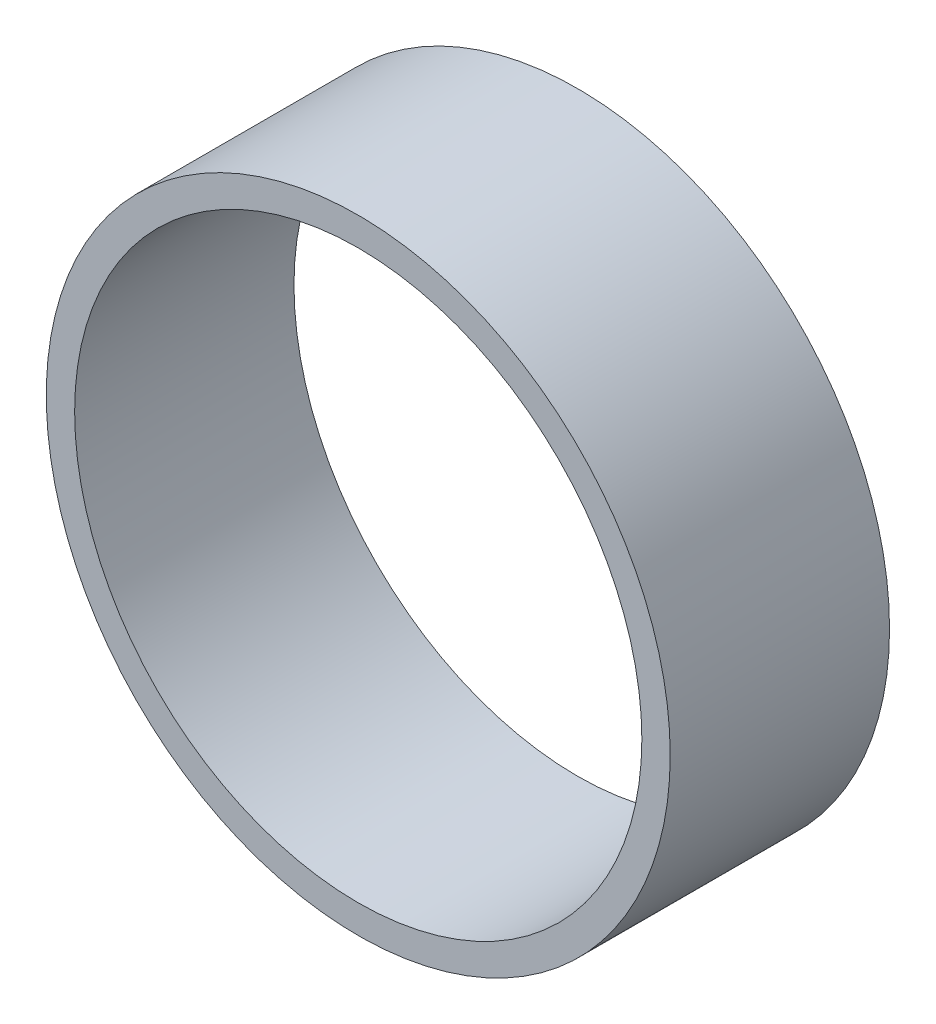
ISO-10303-21;
HEADER;
FILE_DESCRIPTION(('STEP AP214'),'2;1');
FILE_NAME('part.step','',(''),(''),'','','');
FILE_SCHEMA(('AUTOMOTIVE_DESIGN { 1 0 10303 214 1 1 1 1 }'));
ENDSEC;
DATA;
#1=APPLICATION_CONTEXT('core data for automotive mechanical design processes');
#2=APPLICATION_PROTOCOL_DEFINITION('international standard','automotive_design',2000,#1);
#3=PRODUCT_CONTEXT('',#1,'mechanical');
#4=PRODUCT('Part','Part','',(#3));
#5=PRODUCT_RELATED_PRODUCT_CATEGORY('part','',(#4));
#6=PRODUCT_DEFINITION_FORMATION('','',#4);
#7=PRODUCT_DEFINITION_CONTEXT('part definition',#1,'design');
#8=PRODUCT_DEFINITION('design','',#6,#7);
#9=PRODUCT_DEFINITION_SHAPE('','',#8);
#10=(LENGTH_UNIT() NAMED_UNIT(*) SI_UNIT(.MILLI.,.METRE.));
#11=(NAMED_UNIT(*) PLANE_ANGLE_UNIT() SI_UNIT($,.RADIAN.));
#12=(NAMED_UNIT(*) SI_UNIT($,.STERADIAN.) SOLID_ANGLE_UNIT());
#13=UNCERTAINTY_MEASURE_WITH_UNIT(LENGTH_MEASURE(1.E-05),#10,'distance_accuracy_value','');
#14=(GEOMETRIC_REPRESENTATION_CONTEXT(3) GLOBAL_UNCERTAINTY_ASSIGNED_CONTEXT((#13)) GLOBAL_UNIT_ASSIGNED_CONTEXT((#10,
#11,#12)) REPRESENTATION_CONTEXT('',''));
#15=CARTESIAN_POINT('',(0.,0.,0.));
#16=DIRECTION('',(0.,0.,1.));
#17=DIRECTION('',(1.,0.,0.));
#18=AXIS2_PLACEMENT_3D('',#15,#16,#17);
#19=CARTESIAN_POINT('',(-43.2126646474919,1.44186566085188,5.8));
#20=DIRECTION('',(0.,0.,-1.));
#21=DIRECTION('',(-1.,0.,0.));
#22=AXIS2_PLACEMENT_3D('',#19,#20,#21);
#23=CYLINDRICAL_SURFACE('',#22,8.25);
#24=CARTESIAN_POINT('',(-43.2126646474919,1.44186566085188,5.8));
#25=DIRECTION('',(0.,0.,1.));
#26=DIRECTION('',(1.,0.,0.));
#27=AXIS2_PLACEMENT_3D('',#24,#25,#26);
#28=CIRCLE('',#27,8.25);
#29=CARTESIAN_POINT('',(-34.9626646474919,1.44186566085188,5.8));
#30=VERTEX_POINT('',#29);
#31=EDGE_CURVE('E10',#30,#30,#28,.T.);
#32=ORIENTED_EDGE('',*,*,#31,.F.);
#33=EDGE_LOOP('',(#32));
#34=FACE_BOUND('',#33,.T.);
#35=CARTESIAN_POINT('',(-43.2126646474919,1.44186566085188,0.));
#36=DIRECTION('',(0.,0.,1.));
#37=DIRECTION('',(1.,0.,0.));
#38=AXIS2_PLACEMENT_3D('',#35,#36,#37);
#39=CIRCLE('',#38,8.25);
#40=CARTESIAN_POINT('',(-34.9626646474919,1.44186566085188,0.));
#41=VERTEX_POINT('',#40);
#42=EDGE_CURVE('E36',#41,#41,#39,.T.);
#43=ORIENTED_EDGE('',*,*,#42,.T.);
#44=EDGE_LOOP('',(#43));
#45=FACE_BOUND('',#44,.T.);
#46=ADVANCED_FACE('F33',(#34,#45),#23,.T.);
#47=CARTESIAN_POINT('',(-43.2126646474919,1.44186566085188,5.8));
#48=DIRECTION('',(0.,0.,1.));
#49=DIRECTION('',(1.,0.,0.));
#50=AXIS2_PLACEMENT_3D('',#47,#48,#49);
#51=PLANE('',#50);
#52=CARTESIAN_POINT('',(-43.2126646474919,1.44186566085188,5.8));
#53=DIRECTION('',(0.,0.,1.));
#54=DIRECTION('',(1.,0.,0.));
#55=AXIS2_PLACEMENT_3D('',#52,#53,#54);
#56=CIRCLE('',#55,7.5);
#57=CARTESIAN_POINT('',(-35.7126646474919,1.44186566085188,5.8));
#58=VERTEX_POINT('',#57);
#59=EDGE_CURVE('E45',#58,#58,#56,.T.);
#60=ORIENTED_EDGE('',*,*,#59,.F.);
#61=EDGE_LOOP('',(#60));
#62=FACE_BOUND('',#61,.T.);
#63=ORIENTED_EDGE('',*,*,#31,.T.);
#64=EDGE_LOOP('',(#63));
#65=FACE_BOUND('',#64,.T.);
#66=ADVANCED_FACE('F60',(#62,#65),#51,.T.);
#67=CARTESIAN_POINT('',(-43.2126646474919,1.44186566085188,0.));
#68=DIRECTION('',(0.,0.,1.));
#69=DIRECTION('',(1.,0.,0.));
#70=AXIS2_PLACEMENT_3D('',#67,#68,#69);
#71=PLANE('',#70);
#72=CARTESIAN_POINT('',(-43.2126646474919,1.44186566085188,0.));
#73=DIRECTION('',(0.,0.,1.));
#74=DIRECTION('',(1.,0.,0.));
#75=AXIS2_PLACEMENT_3D('',#72,#73,#74);
#76=CIRCLE('',#75,7.5);
#77=CARTESIAN_POINT('',(-35.7126646474919,1.44186566085188,0.));
#78=VERTEX_POINT('',#77);
#79=EDGE_CURVE('E43',#78,#78,#76,.T.);
#80=ORIENTED_EDGE('',*,*,#79,.T.);
#81=EDGE_LOOP('',(#80));
#82=FACE_BOUND('',#81,.T.);
#83=ORIENTED_EDGE('',*,*,#42,.F.);
#84=EDGE_LOOP('',(#83));
#85=FACE_BOUND('',#84,.T.);
#86=ADVANCED_FACE('F51',(#82,#85),#71,.F.);
#87=CARTESIAN_POINT('',(-43.2126646474919,1.44186566085188,0.));
#88=DIRECTION('',(0.,0.,1.));
#89=DIRECTION('',(1.,0.,0.));
#90=AXIS2_PLACEMENT_3D('',#87,#88,#89);
#91=CYLINDRICAL_SURFACE('',#90,7.5);
#92=ORIENTED_EDGE('',*,*,#79,.F.);
#93=EDGE_LOOP('',(#92));
#94=FACE_BOUND('',#93,.T.);
#95=ORIENTED_EDGE('',*,*,#59,.T.);
#96=EDGE_LOOP('',(#95));
#97=FACE_BOUND('',#96,.T.);
#98=ADVANCED_FACE('F54',(#94,#97),#91,.F.);
#99=CLOSED_SHELL('',(#46,#66,#86,#98));
#100=MANIFOLD_SOLID_BREP('B2',#99);
#101=ADVANCED_BREP_SHAPE_REPRESENTATION('',(#18,#100),#14);
#102=SHAPE_DEFINITION_REPRESENTATION(#9,#101);
ENDSEC;
END-ISO-10303-21;
